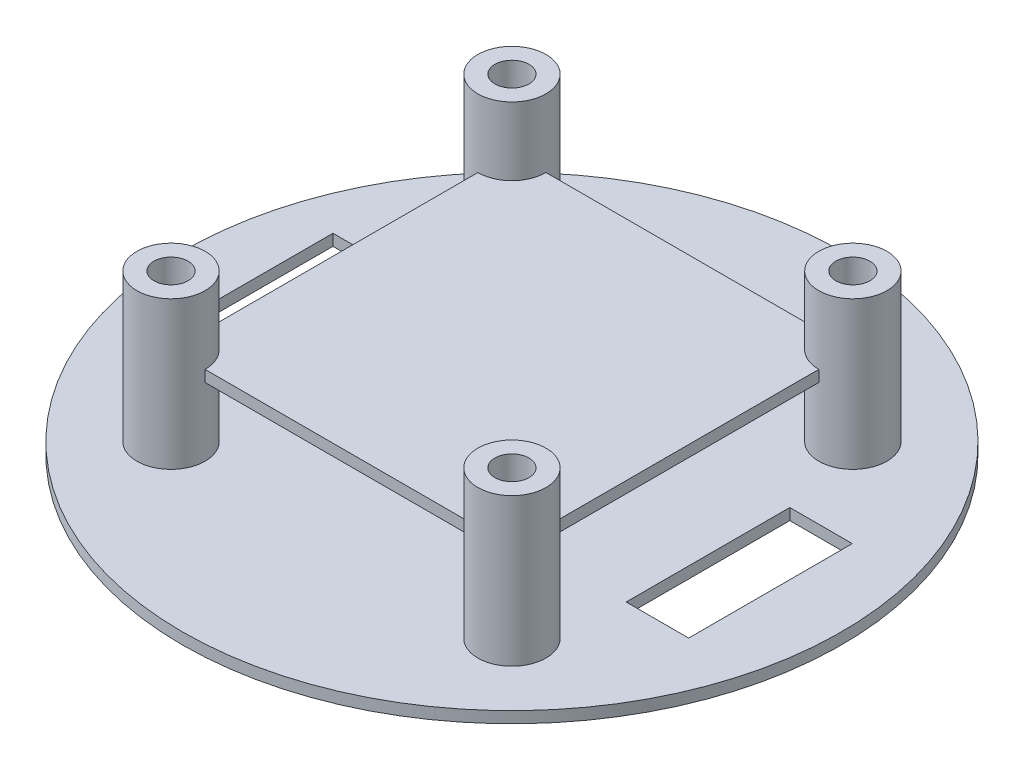
ISO-10303-21;
HEADER;
FILE_DESCRIPTION(('STEP AP214'),'2;1');
FILE_NAME('part.step','',(''),(''),'','','');
FILE_SCHEMA(('AUTOMOTIVE_DESIGN { 1 0 10303 214 1 1 1 1 }'));
ENDSEC;
DATA;
#1=APPLICATION_CONTEXT('core data for automotive mechanical design processes');
#2=APPLICATION_PROTOCOL_DEFINITION('international standard','automotive_design',2000,#1);
#3=PRODUCT_CONTEXT('',#1,'mechanical');
#4=PRODUCT('Part','Part','',(#3));
#5=PRODUCT_RELATED_PRODUCT_CATEGORY('part','',(#4));
#6=PRODUCT_DEFINITION_FORMATION('','',#4);
#7=PRODUCT_DEFINITION_CONTEXT('part definition',#1,'design');
#8=PRODUCT_DEFINITION('design','',#6,#7);
#9=PRODUCT_DEFINITION_SHAPE('','',#8);
#10=(LENGTH_UNIT() NAMED_UNIT(*) SI_UNIT(.MILLI.,.METRE.));
#11=(NAMED_UNIT(*) PLANE_ANGLE_UNIT() SI_UNIT($,.RADIAN.));
#12=(NAMED_UNIT(*) SI_UNIT($,.STERADIAN.) SOLID_ANGLE_UNIT());
#13=UNCERTAINTY_MEASURE_WITH_UNIT(LENGTH_MEASURE(1.E-05),#10,'distance_accuracy_value','');
#14=(GEOMETRIC_REPRESENTATION_CONTEXT(3) GLOBAL_UNCERTAINTY_ASSIGNED_CONTEXT((#13)) GLOBAL_UNIT_ASSIGNED_CONTEXT((#10,
#11,#12)) REPRESENTATION_CONTEXT('',''));
#15=CARTESIAN_POINT('',(0.,0.,0.));
#16=DIRECTION('',(0.,0.,1.));
#17=DIRECTION('',(1.,0.,0.));
#18=AXIS2_PLACEMENT_3D('',#15,#16,#17);
#19=CARTESIAN_POINT('',(-15.,8.,-15.));
#20=DIRECTION('',(0.,1.,0.));
#21=DIRECTION('',(0.,0.,1.));
#22=AXIS2_PLACEMENT_3D('',#19,#20,#21);
#23=PLANE('',#22);
#24=DIRECTION('',(0.,0.,1.));
#25=VECTOR('',#24,1.);
#26=CARTESIAN_POINT('',(-15.,8.,12.));
#27=LINE('',#26,#25);
#28=CARTESIAN_POINT('',(-15.,8.,-12.));
#29=VERTEX_POINT('',#28);
#30=CARTESIAN_POINT('',(-15.,8.,12.));
#31=VERTEX_POINT('',#30);
#32=EDGE_CURVE('E266',#29,#31,#27,.T.);
#33=ORIENTED_EDGE('',*,*,#32,.T.);
#34=CARTESIAN_POINT('',(-15.,8.,15.));
#35=DIRECTION('',(0.,1.,0.));
#36=DIRECTION('',(0.,0.,1.));
#37=AXIS2_PLACEMENT_3D('',#34,#35,#36);
#38=CIRCLE('',#37,3.);
#39=CARTESIAN_POINT('',(-12.,8.,15.));
#40=VERTEX_POINT('',#39);
#41=EDGE_CURVE('E238',#40,#31,#38,.T.);
#42=ORIENTED_EDGE('',*,*,#41,.F.);
#43=DIRECTION('',(1.,0.,0.));
#44=VECTOR('',#43,1.);
#45=CARTESIAN_POINT('',(-12.,8.,15.));
#46=LINE('',#45,#44);
#47=CARTESIAN_POINT('',(12.,8.,15.));
#48=VERTEX_POINT('',#47);
#49=EDGE_CURVE('E260',#40,#48,#46,.T.);
#50=ORIENTED_EDGE('',*,*,#49,.T.);
#51=CARTESIAN_POINT('',(15.,8.,15.));
#52=DIRECTION('',(0.,1.,0.));
#53=DIRECTION('',(0.,0.,1.));
#54=AXIS2_PLACEMENT_3D('',#51,#52,#53);
#55=CIRCLE('',#54,3.);
#56=CARTESIAN_POINT('',(15.,8.,12.));
#57=VERTEX_POINT('',#56);
#58=EDGE_CURVE('E250',#57,#48,#55,.T.);
#59=ORIENTED_EDGE('',*,*,#58,.F.);
#60=DIRECTION('',(0.,0.,-1.));
#61=VECTOR('',#60,1.);
#62=CARTESIAN_POINT('',(15.,8.,12.));
#63=LINE('',#62,#61);
#64=CARTESIAN_POINT('',(15.,8.,-12.));
#65=VERTEX_POINT('',#64);
#66=EDGE_CURVE('E289',#57,#65,#63,.T.);
#67=ORIENTED_EDGE('',*,*,#66,.T.);
#68=CARTESIAN_POINT('',(15.,8.,-15.));
#69=DIRECTION('',(0.,1.,0.));
#70=DIRECTION('',(0.,0.,1.));
#71=AXIS2_PLACEMENT_3D('',#68,#69,#70);
#72=CIRCLE('',#71,3.);
#73=CARTESIAN_POINT('',(12.,8.,-15.));
#74=VERTEX_POINT('',#73);
#75=EDGE_CURVE('E11',#74,#65,#72,.T.);
#76=ORIENTED_EDGE('',*,*,#75,.F.);
#77=DIRECTION('',(-1.,0.,0.));
#78=VECTOR('',#77,1.);
#79=CARTESIAN_POINT('',(-12.,8.,-15.));
#80=LINE('',#79,#78);
#81=CARTESIAN_POINT('',(-12.,8.,-15.));
#82=VERTEX_POINT('',#81);
#83=EDGE_CURVE('E292',#74,#82,#80,.T.);
#84=ORIENTED_EDGE('',*,*,#83,.T.);
#85=CARTESIAN_POINT('',(-15.,8.,-15.));
#86=DIRECTION('',(0.,1.,0.));
#87=DIRECTION('',(0.,0.,1.));
#88=AXIS2_PLACEMENT_3D('',#85,#86,#87);
#89=CIRCLE('',#88,3.);
#90=EDGE_CURVE('E244',#29,#82,#89,.T.);
#91=ORIENTED_EDGE('',*,*,#90,.F.);
#92=EDGE_LOOP('',(#33,#42,#50,#59,#67,#76,#84,#91));
#93=FACE_BOUND('',#92,.T.);
#94=ADVANCED_FACE('F35',(#93),#23,.T.);
#95=CARTESIAN_POINT('',(0.,1.,0.));
#96=DIRECTION('',(0.,-1.,0.));
#97=DIRECTION('',(0.,0.,-1.));
#98=AXIS2_PLACEMENT_3D('',#95,#96,#97);
#99=CYLINDRICAL_SURFACE('',#98,29.);
#100=CARTESIAN_POINT('',(0.,1.,0.));
#101=DIRECTION('',(0.,1.,0.));
#102=DIRECTION('',(0.,0.,1.));
#103=AXIS2_PLACEMENT_3D('',#100,#101,#102);
#104=CIRCLE('',#103,29.);
#105=CARTESIAN_POINT('',(0.,1.,29.));
#106=VERTEX_POINT('',#105);
#107=EDGE_CURVE('E44',#106,#106,#104,.T.);
#108=ORIENTED_EDGE('',*,*,#107,.F.);
#109=EDGE_LOOP('',(#108));
#110=FACE_BOUND('',#109,.T.);
#111=CARTESIAN_POINT('',(0.,0.,0.));
#112=DIRECTION('',(0.,1.,0.));
#113=DIRECTION('',(0.,0.,1.));
#114=AXIS2_PLACEMENT_3D('',#111,#112,#113);
#115=CIRCLE('',#114,29.);
#116=CARTESIAN_POINT('',(0.,0.,29.));
#117=VERTEX_POINT('',#116);
#118=EDGE_CURVE('E39',#117,#117,#115,.T.);
#119=ORIENTED_EDGE('',*,*,#118,.T.);
#120=EDGE_LOOP('',(#119));
#121=FACE_BOUND('',#120,.T.);
#122=ADVANCED_FACE('F37',(#110,#121),#99,.T.);
#123=CARTESIAN_POINT('',(0.,1.,0.));
#124=DIRECTION('',(0.,1.,0.));
#125=DIRECTION('',(0.,0.,1.));
#126=AXIS2_PLACEMENT_3D('',#123,#124,#125);
#127=PLANE('',#126);
#128=DIRECTION('',(0.,0.,1.));
#129=VECTOR('',#128,1.);
#130=CARTESIAN_POINT('',(-16.25,1.,8.));
#131=LINE('',#130,#129);
#132=CARTESIAN_POINT('',(-16.25,1.,-8.));
#133=VERTEX_POINT('',#132);
#134=CARTESIAN_POINT('',(-16.25,1.,8.));
#135=VERTEX_POINT('',#134);
#136=EDGE_CURVE('E160',#133,#135,#131,.T.);
#137=ORIENTED_EDGE('',*,*,#136,.T.);
#138=DIRECTION('',(-1.,0.,0.));
#139=VECTOR('',#138,1.);
#140=CARTESIAN_POINT('',(-23.75,1.,8.));
#141=LINE('',#140,#139);
#142=CARTESIAN_POINT('',(-23.75,1.,8.));
#143=VERTEX_POINT('',#142);
#144=EDGE_CURVE('E149',#135,#143,#141,.T.);
#145=ORIENTED_EDGE('',*,*,#144,.T.);
#146=DIRECTION('',(0.,0.,-1.));
#147=VECTOR('',#146,1.);
#148=CARTESIAN_POINT('',(-23.75,1.,8.));
#149=LINE('',#148,#147);
#150=CARTESIAN_POINT('',(-23.75,1.,-8.));
#151=VERTEX_POINT('',#150);
#152=EDGE_CURVE('E171',#143,#151,#149,.T.);
#153=ORIENTED_EDGE('',*,*,#152,.T.);
#154=DIRECTION('',(1.,0.,0.));
#155=VECTOR('',#154,1.);
#156=CARTESIAN_POINT('',(-23.75,1.,-8.));
#157=LINE('',#156,#155);
#158=EDGE_CURVE('E167',#151,#133,#157,.T.);
#159=ORIENTED_EDGE('',*,*,#158,.T.);
#160=EDGE_LOOP('',(#137,#145,#153,#159));
#161=FACE_BOUND('',#160,.T.);
#162=DIRECTION('',(0.,0.,1.));
#163=VECTOR('',#162,1.);
#164=CARTESIAN_POINT('',(22.75,1.,-7.2));
#165=LINE('',#164,#163);
#166=CARTESIAN_POINT('',(22.75,1.,-7.2));
#167=VERTEX_POINT('',#166);
#168=CARTESIAN_POINT('',(22.75,1.,7.2));
#169=VERTEX_POINT('',#168);
#170=EDGE_CURVE('E190',#167,#169,#165,.T.);
#171=ORIENTED_EDGE('',*,*,#170,.T.);
#172=DIRECTION('',(-1.,0.,0.));
#173=VECTOR('',#172,1.);
#174=CARTESIAN_POINT('',(17.25,1.,7.2));
#175=LINE('',#174,#173);
#176=CARTESIAN_POINT('',(17.25,1.,7.2));
#177=VERTEX_POINT('',#176);
#178=EDGE_CURVE('E207',#169,#177,#175,.T.);
#179=ORIENTED_EDGE('',*,*,#178,.T.);
#180=DIRECTION('',(0.,0.,-1.));
#181=VECTOR('',#180,1.);
#182=CARTESIAN_POINT('',(17.25,1.,-7.2));
#183=LINE('',#182,#181);
#184=CARTESIAN_POINT('',(17.25,1.,-7.2));
#185=VERTEX_POINT('',#184);
#186=EDGE_CURVE('E156',#177,#185,#183,.T.);
#187=ORIENTED_EDGE('',*,*,#186,.T.);
#188=DIRECTION('',(1.,0.,0.));
#189=VECTOR('',#188,1.);
#190=CARTESIAN_POINT('',(17.25,1.,-7.2));
#191=LINE('',#190,#189);
#192=EDGE_CURVE('E187',#185,#167,#191,.T.);
#193=ORIENTED_EDGE('',*,*,#192,.T.);
#194=EDGE_LOOP('',(#171,#179,#187,#193));
#195=FACE_BOUND('',#194,.T.);
#196=CARTESIAN_POINT('',(15.,1.,15.));
#197=DIRECTION('',(0.,1.,0.));
#198=DIRECTION('',(0.,0.,1.));
#199=AXIS2_PLACEMENT_3D('',#196,#197,#198);
#200=CIRCLE('',#199,3.);
#201=CARTESIAN_POINT('',(15.,1.,18.));
#202=VERTEX_POINT('',#201);
#203=EDGE_CURVE('E298',#202,#202,#200,.T.);
#204=ORIENTED_EDGE('',*,*,#203,.F.);
#205=EDGE_LOOP('',(#204));
#206=FACE_BOUND('',#205,.T.);
#207=CARTESIAN_POINT('',(-15.,1.,15.));
#208=DIRECTION('',(0.,1.,0.));
#209=DIRECTION('',(0.,0.,1.));
#210=AXIS2_PLACEMENT_3D('',#207,#208,#209);
#211=CIRCLE('',#210,3.);
#212=CARTESIAN_POINT('',(-15.,1.,18.));
#213=VERTEX_POINT('',#212);
#214=EDGE_CURVE('E317',#213,#213,#211,.T.);
#215=ORIENTED_EDGE('',*,*,#214,.F.);
#216=EDGE_LOOP('',(#215));
#217=FACE_BOUND('',#216,.T.);
#218=CARTESIAN_POINT('',(15.,1.,-15.));
#219=DIRECTION('',(0.,1.,0.));
#220=DIRECTION('',(0.,0.,1.));
#221=AXIS2_PLACEMENT_3D('',#218,#219,#220);
#222=CIRCLE('',#221,3.);
#223=CARTESIAN_POINT('',(15.,1.,-12.));
#224=VERTEX_POINT('',#223);
#225=EDGE_CURVE('E320',#224,#224,#222,.T.);
#226=ORIENTED_EDGE('',*,*,#225,.F.);
#227=EDGE_LOOP('',(#226));
#228=FACE_BOUND('',#227,.T.);
#229=CARTESIAN_POINT('',(-15.,1.,-15.));
#230=DIRECTION('',(0.,1.,0.));
#231=DIRECTION('',(0.,0.,1.));
#232=AXIS2_PLACEMENT_3D('',#229,#230,#231);
#233=CIRCLE('',#232,3.);
#234=CARTESIAN_POINT('',(-15.,1.,-12.));
#235=VERTEX_POINT('',#234);
#236=EDGE_CURVE('E323',#235,#235,#233,.T.);
#237=ORIENTED_EDGE('',*,*,#236,.F.);
#238=EDGE_LOOP('',(#237));
#239=FACE_BOUND('',#238,.T.);
#240=ORIENTED_EDGE('',*,*,#107,.T.);
#241=EDGE_LOOP('',(#240));
#242=FACE_BOUND('',#241,.T.);
#243=ADVANCED_FACE('F165',(#161,#195,#206,#217,#228,#239,#242),#127,.T.);
#244=CARTESIAN_POINT('',(0.,0.,0.));
#245=DIRECTION('',(0.,1.,0.));
#246=DIRECTION('',(0.,0.,1.));
#247=AXIS2_PLACEMENT_3D('',#244,#245,#246);
#248=PLANE('',#247);
#249=DIRECTION('',(-1.,0.,0.));
#250=VECTOR('',#249,1.);
#251=CARTESIAN_POINT('',(-23.75,0.,8.));
#252=LINE('',#251,#250);
#253=CARTESIAN_POINT('',(-16.25,0.,8.));
#254=VERTEX_POINT('',#253);
#255=CARTESIAN_POINT('',(-23.75,0.,8.));
#256=VERTEX_POINT('',#255);
#257=EDGE_CURVE('E169',#254,#256,#252,.T.);
#258=ORIENTED_EDGE('',*,*,#257,.F.);
#259=DIRECTION('',(0.,0.,1.));
#260=VECTOR('',#259,1.);
#261=CARTESIAN_POINT('',(-16.25,0.,8.));
#262=LINE('',#261,#260);
#263=CARTESIAN_POINT('',(-16.25,0.,-8.));
#264=VERTEX_POINT('',#263);
#265=EDGE_CURVE('E60',#264,#254,#262,.T.);
#266=ORIENTED_EDGE('',*,*,#265,.F.);
#267=DIRECTION('',(1.,0.,0.));
#268=VECTOR('',#267,1.);
#269=CARTESIAN_POINT('',(-23.75,0.,-8.));
#270=LINE('',#269,#268);
#271=CARTESIAN_POINT('',(-23.75,0.,-8.));
#272=VERTEX_POINT('',#271);
#273=EDGE_CURVE('E162',#272,#264,#270,.T.);
#274=ORIENTED_EDGE('',*,*,#273,.F.);
#275=DIRECTION('',(0.,0.,-1.));
#276=VECTOR('',#275,1.);
#277=CARTESIAN_POINT('',(-23.75,0.,8.));
#278=LINE('',#277,#276);
#279=EDGE_CURVE('E176',#256,#272,#278,.T.);
#280=ORIENTED_EDGE('',*,*,#279,.F.);
#281=EDGE_LOOP('',(#258,#266,#274,#280));
#282=FACE_BOUND('',#281,.T.);
#283=DIRECTION('',(-1.,0.,0.));
#284=VECTOR('',#283,1.);
#285=CARTESIAN_POINT('',(17.25,0.,7.2));
#286=LINE('',#285,#284);
#287=CARTESIAN_POINT('',(22.75,0.,7.2));
#288=VERTEX_POINT('',#287);
#289=CARTESIAN_POINT('',(17.25,0.,7.2));
#290=VERTEX_POINT('',#289);
#291=EDGE_CURVE('E195',#288,#290,#286,.T.);
#292=ORIENTED_EDGE('',*,*,#291,.F.);
#293=DIRECTION('',(0.,0.,1.));
#294=VECTOR('',#293,1.);
#295=CARTESIAN_POINT('',(22.75,0.,-7.2));
#296=LINE('',#295,#294);
#297=CARTESIAN_POINT('',(22.75,0.,-7.2));
#298=VERTEX_POINT('',#297);
#299=EDGE_CURVE('E193',#298,#288,#296,.T.);
#300=ORIENTED_EDGE('',*,*,#299,.F.);
#301=DIRECTION('',(1.,0.,0.));
#302=VECTOR('',#301,1.);
#303=CARTESIAN_POINT('',(17.25,0.,-7.2));
#304=LINE('',#303,#302);
#305=CARTESIAN_POINT('',(17.25,0.,-7.2));
#306=VERTEX_POINT('',#305);
#307=EDGE_CURVE('E201',#306,#298,#304,.T.);
#308=ORIENTED_EDGE('',*,*,#307,.F.);
#309=DIRECTION('',(0.,0.,-1.));
#310=VECTOR('',#309,1.);
#311=CARTESIAN_POINT('',(17.25,0.,-7.2));
#312=LINE('',#311,#310);
#313=EDGE_CURVE('E198',#290,#306,#312,.T.);
#314=ORIENTED_EDGE('',*,*,#313,.F.);
#315=EDGE_LOOP('',(#292,#300,#308,#314));
#316=FACE_BOUND('',#315,.T.);
#317=ORIENTED_EDGE('',*,*,#118,.F.);
#318=EDGE_LOOP('',(#317));
#319=FACE_BOUND('',#318,.T.);
#320=ADVANCED_FACE('F332',(#282,#316,#319),#248,.F.);
#321=CARTESIAN_POINT('',(-15.,8.,-15.));
#322=DIRECTION('',(0.,-1.,0.));
#323=DIRECTION('',(0.,0.,-1.));
#324=AXIS2_PLACEMENT_3D('',#321,#322,#323);
#325=CYLINDRICAL_SURFACE('',#324,3.);
#326=CARTESIAN_POINT('',(-15.,7.,-15.));
#327=DIRECTION('',(0.,-1.,0.));
#328=DIRECTION('',(0.,0.,-1.));
#329=AXIS2_PLACEMENT_3D('',#326,#327,#328);
#330=CIRCLE('',#329,3.);
#331=CARTESIAN_POINT('',(-12.,7.,-15.));
#332=VERTEX_POINT('',#331);
#333=CARTESIAN_POINT('',(-15.,7.,-12.));
#334=VERTEX_POINT('',#333);
#335=EDGE_CURVE('E281',#332,#334,#330,.T.);
#336=ORIENTED_EDGE('',*,*,#335,.T.);
#337=DIRECTION('',(0.,1.,0.));
#338=VECTOR('',#337,1.);
#339=CARTESIAN_POINT('',(-15.,7.,-12.));
#340=LINE('',#339,#338);
#341=EDGE_CURVE('E299',#334,#29,#340,.T.);
#342=ORIENTED_EDGE('',*,*,#341,.T.);
#343=ORIENTED_EDGE('',*,*,#90,.T.);
#344=DIRECTION('',(0.,1.,0.));
#345=VECTOR('',#344,1.);
#346=CARTESIAN_POINT('',(-12.,7.,-15.));
#347=LINE('',#346,#345);
#348=EDGE_CURVE('E301',#332,#82,#347,.T.);
#349=ORIENTED_EDGE('',*,*,#348,.F.);
#350=EDGE_LOOP('',(#336,#342,#343,#349));
#351=FACE_BOUND('',#350,.T.);
#352=ORIENTED_EDGE('',*,*,#236,.T.);
#353=EDGE_LOOP('',(#352));
#354=FACE_BOUND('',#353,.T.);
#355=CARTESIAN_POINT('',(-15.,14.,-15.));
#356=DIRECTION('',(0.,1.,0.));
#357=DIRECTION('',(0.,0.,1.));
#358=AXIS2_PLACEMENT_3D('',#355,#356,#357);
#359=CIRCLE('',#358,3.);
#360=CARTESIAN_POINT('',(-15.,14.,-12.));
#361=VERTEX_POINT('',#360);
#362=EDGE_CURVE('E247',#361,#361,#359,.T.);
#363=ORIENTED_EDGE('',*,*,#362,.F.);
#364=EDGE_LOOP('',(#363));
#365=FACE_BOUND('',#364,.T.);
#366=ADVANCED_FACE('F334',(#351,#354,#365),#325,.T.);
#367=CARTESIAN_POINT('',(15.,8.,-15.));
#368=DIRECTION('',(0.,-1.,0.));
#369=DIRECTION('',(0.,0.,-1.));
#370=AXIS2_PLACEMENT_3D('',#367,#368,#369);
#371=CYLINDRICAL_SURFACE('',#370,3.);
#372=CARTESIAN_POINT('',(15.,7.,-15.));
#373=DIRECTION('',(0.,-1.,0.));
#374=DIRECTION('',(0.,0.,-1.));
#375=AXIS2_PLACEMENT_3D('',#372,#373,#374);
#376=CIRCLE('',#375,3.);
#377=CARTESIAN_POINT('',(15.,7.,-12.));
#378=VERTEX_POINT('',#377);
#379=CARTESIAN_POINT('',(12.,7.,-15.));
#380=VERTEX_POINT('',#379);
#381=EDGE_CURVE('E275',#378,#380,#376,.T.);
#382=ORIENTED_EDGE('',*,*,#381,.T.);
#383=DIRECTION('',(0.,1.,0.));
#384=VECTOR('',#383,1.);
#385=CARTESIAN_POINT('',(12.,7.,-15.));
#386=LINE('',#385,#384);
#387=EDGE_CURVE('E304',#380,#74,#386,.T.);
#388=ORIENTED_EDGE('',*,*,#387,.T.);
#389=ORIENTED_EDGE('',*,*,#75,.T.);
#390=DIRECTION('',(0.,1.,0.));
#391=VECTOR('',#390,1.);
#392=CARTESIAN_POINT('',(15.,7.,-12.));
#393=LINE('',#392,#391);
#394=EDGE_CURVE('E307',#378,#65,#393,.T.);
#395=ORIENTED_EDGE('',*,*,#394,.F.);
#396=EDGE_LOOP('',(#382,#388,#389,#395));
#397=FACE_BOUND('',#396,.T.);
#398=ORIENTED_EDGE('',*,*,#225,.T.);
#399=EDGE_LOOP('',(#398));
#400=FACE_BOUND('',#399,.T.);
#401=CARTESIAN_POINT('',(15.,14.,-15.));
#402=DIRECTION('',(0.,1.,0.));
#403=DIRECTION('',(0.,0.,1.));
#404=AXIS2_PLACEMENT_3D('',#401,#402,#403);
#405=CIRCLE('',#404,3.);
#406=CARTESIAN_POINT('',(15.,14.,-12.));
#407=VERTEX_POINT('',#406);
#408=EDGE_CURVE('E256',#407,#407,#405,.T.);
#409=ORIENTED_EDGE('',*,*,#408,.F.);
#410=EDGE_LOOP('',(#409));
#411=FACE_BOUND('',#410,.T.);
#412=ADVANCED_FACE('F340',(#397,#400,#411),#371,.T.);
#413=CARTESIAN_POINT('',(-15.,8.,15.));
#414=DIRECTION('',(0.,-1.,0.));
#415=DIRECTION('',(0.,0.,-1.));
#416=AXIS2_PLACEMENT_3D('',#413,#414,#415);
#417=CYLINDRICAL_SURFACE('',#416,3.);
#418=DIRECTION('',(0.,1.,0.));
#419=VECTOR('',#418,1.);
#420=CARTESIAN_POINT('',(-12.,7.,15.));
#421=LINE('',#420,#419);
#422=CARTESIAN_POINT('',(-12.,7.,15.));
#423=VERTEX_POINT('',#422);
#424=EDGE_CURVE('E287',#423,#40,#421,.T.);
#425=ORIENTED_EDGE('',*,*,#424,.T.);
#426=ORIENTED_EDGE('',*,*,#41,.T.);
#427=DIRECTION('',(0.,1.,0.));
#428=VECTOR('',#427,1.);
#429=CARTESIAN_POINT('',(-15.,7.,12.));
#430=LINE('',#429,#428);
#431=CARTESIAN_POINT('',(-15.,7.,12.));
#432=VERTEX_POINT('',#431);
#433=EDGE_CURVE('E295',#432,#31,#430,.T.);
#434=ORIENTED_EDGE('',*,*,#433,.F.);
#435=CARTESIAN_POINT('',(-15.,7.,15.));
#436=DIRECTION('',(0.,-1.,0.));
#437=DIRECTION('',(0.,0.,1.));
#438=AXIS2_PLACEMENT_3D('',#435,#436,#437);
#439=CIRCLE('',#438,3.);
#440=EDGE_CURVE('E262',#432,#423,#439,.T.);
#441=ORIENTED_EDGE('',*,*,#440,.T.);
#442=EDGE_LOOP('',(#425,#426,#434,#441));
#443=FACE_BOUND('',#442,.T.);
#444=ORIENTED_EDGE('',*,*,#214,.T.);
#445=EDGE_LOOP('',(#444));
#446=FACE_BOUND('',#445,.T.);
#447=CARTESIAN_POINT('',(-15.,14.,15.));
#448=DIRECTION('',(0.,1.,0.));
#449=DIRECTION('',(0.,0.,1.));
#450=AXIS2_PLACEMENT_3D('',#447,#448,#449);
#451=CIRCLE('',#450,3.);
#452=CARTESIAN_POINT('',(-15.,14.,18.));
#453=VERTEX_POINT('',#452);
#454=EDGE_CURVE('E241',#453,#453,#451,.T.);
#455=ORIENTED_EDGE('',*,*,#454,.F.);
#456=EDGE_LOOP('',(#455));
#457=FACE_BOUND('',#456,.T.);
#458=ADVANCED_FACE('F355',(#443,#446,#457),#417,.T.);
#459=CARTESIAN_POINT('',(15.,8.,15.));
#460=DIRECTION('',(0.,-1.,0.));
#461=DIRECTION('',(0.,0.,-1.));
#462=AXIS2_PLACEMENT_3D('',#459,#460,#461);
#463=CYLINDRICAL_SURFACE('',#462,3.);
#464=CARTESIAN_POINT('',(15.,7.,15.));
#465=DIRECTION('',(0.,-1.,0.));
#466=DIRECTION('',(0.,0.,-1.));
#467=AXIS2_PLACEMENT_3D('',#464,#465,#466);
#468=CIRCLE('',#467,3.);
#469=CARTESIAN_POINT('',(12.,7.,15.));
#470=VERTEX_POINT('',#469);
#471=CARTESIAN_POINT('',(15.,7.,12.));
#472=VERTEX_POINT('',#471);
#473=EDGE_CURVE('E269',#470,#472,#468,.T.);
#474=ORIENTED_EDGE('',*,*,#473,.T.);
#475=DIRECTION('',(0.,1.,0.));
#476=VECTOR('',#475,1.);
#477=CARTESIAN_POINT('',(15.,7.,12.));
#478=LINE('',#477,#476);
#479=EDGE_CURVE('E309',#472,#57,#478,.T.);
#480=ORIENTED_EDGE('',*,*,#479,.T.);
#481=ORIENTED_EDGE('',*,*,#58,.T.);
#482=DIRECTION('',(0.,1.,0.));
#483=VECTOR('',#482,1.);
#484=CARTESIAN_POINT('',(12.,7.,15.));
#485=LINE('',#484,#483);
#486=EDGE_CURVE('E311',#470,#48,#485,.T.);
#487=ORIENTED_EDGE('',*,*,#486,.F.);
#488=EDGE_LOOP('',(#474,#480,#481,#487));
#489=FACE_BOUND('',#488,.T.);
#490=ORIENTED_EDGE('',*,*,#203,.T.);
#491=EDGE_LOOP('',(#490));
#492=FACE_BOUND('',#491,.T.);
#493=CARTESIAN_POINT('',(15.,14.,15.));
#494=DIRECTION('',(0.,1.,0.));
#495=DIRECTION('',(0.,0.,1.));
#496=AXIS2_PLACEMENT_3D('',#493,#494,#495);
#497=CIRCLE('',#496,3.);
#498=CARTESIAN_POINT('',(15.,14.,18.));
#499=VERTEX_POINT('',#498);
#500=EDGE_CURVE('E253',#499,#499,#497,.T.);
#501=ORIENTED_EDGE('',*,*,#500,.F.);
#502=EDGE_LOOP('',(#501));
#503=FACE_BOUND('',#502,.T.);
#504=ADVANCED_FACE('F359',(#489,#492,#503),#463,.T.);
#505=CARTESIAN_POINT('',(-15.,7.,12.));
#506=DIRECTION('',(-1.,0.,0.));
#507=DIRECTION('',(0.,0.,1.));
#508=AXIS2_PLACEMENT_3D('',#505,#506,#507);
#509=PLANE('',#508);
#510=ORIENTED_EDGE('',*,*,#32,.F.);
#511=ORIENTED_EDGE('',*,*,#341,.F.);
#512=DIRECTION('',(0.,0.,1.));
#513=VECTOR('',#512,1.);
#514=CARTESIAN_POINT('',(-15.,7.,12.));
#515=LINE('',#514,#513);
#516=EDGE_CURVE('E284',#334,#432,#515,.T.);
#517=ORIENTED_EDGE('',*,*,#516,.T.);
#518=ORIENTED_EDGE('',*,*,#433,.T.);
#519=EDGE_LOOP('',(#510,#511,#517,#518));
#520=FACE_BOUND('',#519,.T.);
#521=ADVANCED_FACE('F363',(#520),#509,.T.);
#522=CARTESIAN_POINT('',(-12.,7.,-15.));
#523=DIRECTION('',(0.,0.,-1.));
#524=DIRECTION('',(-1.,0.,0.));
#525=AXIS2_PLACEMENT_3D('',#522,#523,#524);
#526=PLANE('',#525);
#527=ORIENTED_EDGE('',*,*,#83,.F.);
#528=ORIENTED_EDGE('',*,*,#387,.F.);
#529=DIRECTION('',(-1.,0.,0.));
#530=VECTOR('',#529,1.);
#531=CARTESIAN_POINT('',(-12.,7.,-15.));
#532=LINE('',#531,#530);
#533=EDGE_CURVE('E278',#380,#332,#532,.T.);
#534=ORIENTED_EDGE('',*,*,#533,.T.);
#535=ORIENTED_EDGE('',*,*,#348,.T.);
#536=EDGE_LOOP('',(#527,#528,#534,#535));
#537=FACE_BOUND('',#536,.T.);
#538=ADVANCED_FACE('F373',(#537),#526,.T.);
#539=CARTESIAN_POINT('',(15.,7.,12.));
#540=DIRECTION('',(1.,0.,0.));
#541=DIRECTION('',(0.,0.,-1.));
#542=AXIS2_PLACEMENT_3D('',#539,#540,#541);
#543=PLANE('',#542);
#544=ORIENTED_EDGE('',*,*,#66,.F.);
#545=ORIENTED_EDGE('',*,*,#479,.F.);
#546=DIRECTION('',(0.,0.,-1.));
#547=VECTOR('',#546,1.);
#548=CARTESIAN_POINT('',(15.,7.,12.));
#549=LINE('',#548,#547);
#550=EDGE_CURVE('E272',#472,#378,#549,.T.);
#551=ORIENTED_EDGE('',*,*,#550,.T.);
#552=ORIENTED_EDGE('',*,*,#394,.T.);
#553=EDGE_LOOP('',(#544,#545,#551,#552));
#554=FACE_BOUND('',#553,.T.);
#555=ADVANCED_FACE('F369',(#554),#543,.T.);
#556=CARTESIAN_POINT('',(-12.,7.,15.));
#557=DIRECTION('',(0.,0.,1.));
#558=DIRECTION('',(1.,0.,0.));
#559=AXIS2_PLACEMENT_3D('',#556,#557,#558);
#560=PLANE('',#559);
#561=ORIENTED_EDGE('',*,*,#49,.F.);
#562=ORIENTED_EDGE('',*,*,#424,.F.);
#563=DIRECTION('',(1.,0.,0.));
#564=VECTOR('',#563,1.);
#565=CARTESIAN_POINT('',(-12.,7.,15.));
#566=LINE('',#565,#564);
#567=EDGE_CURVE('E265',#423,#470,#566,.T.);
#568=ORIENTED_EDGE('',*,*,#567,.T.);
#569=ORIENTED_EDGE('',*,*,#486,.T.);
#570=EDGE_LOOP('',(#561,#562,#568,#569));
#571=FACE_BOUND('',#570,.T.);
#572=ADVANCED_FACE('F365',(#571),#560,.T.);
#573=CARTESIAN_POINT('',(-15.,7.,15.));
#574=DIRECTION('',(0.,1.,0.));
#575=DIRECTION('',(0.,0.,1.));
#576=AXIS2_PLACEMENT_3D('',#573,#574,#575);
#577=PLANE('',#576);
#578=ORIENTED_EDGE('',*,*,#440,.F.);
#579=ORIENTED_EDGE('',*,*,#516,.F.);
#580=ORIENTED_EDGE('',*,*,#335,.F.);
#581=ORIENTED_EDGE('',*,*,#533,.F.);
#582=ORIENTED_EDGE('',*,*,#381,.F.);
#583=ORIENTED_EDGE('',*,*,#550,.F.);
#584=ORIENTED_EDGE('',*,*,#473,.F.);
#585=ORIENTED_EDGE('',*,*,#567,.F.);
#586=EDGE_LOOP('',(#578,#579,#580,#581,#582,#583,#584,#585));
#587=FACE_BOUND('',#586,.T.);
#588=ADVANCED_FACE('F368',(#587),#577,.F.);
#589=CARTESIAN_POINT('',(15.,14.,-15.));
#590=DIRECTION('',(0.,1.,0.));
#591=DIRECTION('',(0.,0.,1.));
#592=AXIS2_PLACEMENT_3D('',#589,#590,#591);
#593=PLANE('',#592);
#594=CARTESIAN_POINT('',(15.,14.,-15.));
#595=DIRECTION('',(0.,1.,0.));
#596=DIRECTION('',(0.,0.,1.));
#597=AXIS2_PLACEMENT_3D('',#594,#595,#596);
#598=CIRCLE('',#597,1.5);
#599=CARTESIAN_POINT('',(15.,14.,-13.5));
#600=VERTEX_POINT('',#599);
#601=EDGE_CURVE('E220',#600,#600,#598,.T.);
#602=ORIENTED_EDGE('',*,*,#601,.F.);
#603=EDGE_LOOP('',(#602));
#604=FACE_BOUND('',#603,.T.);
#605=ORIENTED_EDGE('',*,*,#408,.T.);
#606=EDGE_LOOP('',(#605));
#607=FACE_BOUND('',#606,.T.);
#608=ADVANCED_FACE('F383',(#604,#607),#593,.T.);
#609=CARTESIAN_POINT('',(15.,14.,15.));
#610=DIRECTION('',(0.,1.,0.));
#611=DIRECTION('',(0.,0.,1.));
#612=AXIS2_PLACEMENT_3D('',#609,#610,#611);
#613=PLANE('',#612);
#614=CARTESIAN_POINT('',(15.,14.,15.));
#615=DIRECTION('',(0.,1.,0.));
#616=DIRECTION('',(0.,0.,1.));
#617=AXIS2_PLACEMENT_3D('',#614,#615,#616);
#618=CIRCLE('',#617,1.5);
#619=CARTESIAN_POINT('',(15.,14.,16.5));
#620=VERTEX_POINT('',#619);
#621=EDGE_CURVE('E221',#620,#620,#618,.T.);
#622=ORIENTED_EDGE('',*,*,#621,.F.);
#623=EDGE_LOOP('',(#622));
#624=FACE_BOUND('',#623,.T.);
#625=ORIENTED_EDGE('',*,*,#500,.T.);
#626=EDGE_LOOP('',(#625));
#627=FACE_BOUND('',#626,.T.);
#628=ADVANCED_FACE('F387',(#624,#627),#613,.T.);
#629=CARTESIAN_POINT('',(-15.,14.,-15.));
#630=DIRECTION('',(0.,1.,0.));
#631=DIRECTION('',(0.,0.,1.));
#632=AXIS2_PLACEMENT_3D('',#629,#630,#631);
#633=PLANE('',#632);
#634=CARTESIAN_POINT('',(-15.,14.,-15.));
#635=DIRECTION('',(0.,1.,0.));
#636=DIRECTION('',(0.,0.,1.));
#637=AXIS2_PLACEMENT_3D('',#634,#635,#636);
#638=CIRCLE('',#637,1.5);
#639=CARTESIAN_POINT('',(-15.,14.,-13.5));
#640=VERTEX_POINT('',#639);
#641=EDGE_CURVE('E216',#640,#640,#638,.T.);
#642=ORIENTED_EDGE('',*,*,#641,.F.);
#643=EDGE_LOOP('',(#642));
#644=FACE_BOUND('',#643,.T.);
#645=ORIENTED_EDGE('',*,*,#362,.T.);
#646=EDGE_LOOP('',(#645));
#647=FACE_BOUND('',#646,.T.);
#648=ADVANCED_FACE('F391',(#644,#647),#633,.T.);
#649=CARTESIAN_POINT('',(-15.,14.,15.));
#650=DIRECTION('',(0.,1.,0.));
#651=DIRECTION('',(0.,0.,1.));
#652=AXIS2_PLACEMENT_3D('',#649,#650,#651);
#653=PLANE('',#652);
#654=CARTESIAN_POINT('',(-15.,14.,15.));
#655=DIRECTION('',(0.,1.,0.));
#656=DIRECTION('',(0.,0.,1.));
#657=AXIS2_PLACEMENT_3D('',#654,#655,#656);
#658=CIRCLE('',#657,1.5);
#659=CARTESIAN_POINT('',(-15.,14.,16.5));
#660=VERTEX_POINT('',#659);
#661=EDGE_CURVE('E227',#660,#660,#658,.T.);
#662=ORIENTED_EDGE('',*,*,#661,.F.);
#663=EDGE_LOOP('',(#662));
#664=FACE_BOUND('',#663,.T.);
#665=ORIENTED_EDGE('',*,*,#454,.T.);
#666=EDGE_LOOP('',(#665));
#667=FACE_BOUND('',#666,.T.);
#668=ADVANCED_FACE('F395',(#664,#667),#653,.T.);
#669=CARTESIAN_POINT('',(15.,8.,-15.));
#670=DIRECTION('',(0.,1.,0.));
#671=DIRECTION('',(0.,0.,1.));
#672=AXIS2_PLACEMENT_3D('',#669,#670,#671);
#673=CYLINDRICAL_SURFACE('',#672,1.5);
#674=CARTESIAN_POINT('',(15.,8.,-15.));
#675=DIRECTION('',(0.,1.,0.));
#676=DIRECTION('',(0.,0.,1.));
#677=AXIS2_PLACEMENT_3D('',#674,#675,#676);
#678=CIRCLE('',#677,1.5);
#679=CARTESIAN_POINT('',(15.,8.,-13.5));
#680=VERTEX_POINT('',#679);
#681=EDGE_CURVE('E235',#680,#680,#678,.T.);
#682=ORIENTED_EDGE('',*,*,#681,.F.);
#683=EDGE_LOOP('',(#682));
#684=FACE_BOUND('',#683,.T.);
#685=ORIENTED_EDGE('',*,*,#601,.T.);
#686=EDGE_LOOP('',(#685));
#687=FACE_BOUND('',#686,.T.);
#688=ADVANCED_FACE('F399',(#684,#687),#673,.F.);
#689=CARTESIAN_POINT('',(15.,8.,-15.));
#690=DIRECTION('',(0.,1.,0.));
#691=DIRECTION('',(0.,0.,1.));
#692=AXIS2_PLACEMENT_3D('',#689,#690,#691);
#693=PLANE('',#692);
#694=ORIENTED_EDGE('',*,*,#681,.T.);
#695=EDGE_LOOP('',(#694));
#696=FACE_BOUND('',#695,.T.);
#697=ADVANCED_FACE('F403',(#696),#693,.T.);
#698=CARTESIAN_POINT('',(-15.,8.,15.));
#699=DIRECTION('',(0.,1.,0.));
#700=DIRECTION('',(0.,0.,1.));
#701=AXIS2_PLACEMENT_3D('',#698,#699,#700);
#702=CYLINDRICAL_SURFACE('',#701,1.5);
#703=CARTESIAN_POINT('',(-15.,8.,15.));
#704=DIRECTION('',(0.,1.,0.));
#705=DIRECTION('',(0.,0.,1.));
#706=AXIS2_PLACEMENT_3D('',#703,#704,#705);
#707=CIRCLE('',#706,1.5);
#708=CARTESIAN_POINT('',(-15.,8.,16.5));
#709=VERTEX_POINT('',#708);
#710=EDGE_CURVE('E224',#709,#709,#707,.T.);
#711=ORIENTED_EDGE('',*,*,#710,.F.);
#712=EDGE_LOOP('',(#711));
#713=FACE_BOUND('',#712,.T.);
#714=ORIENTED_EDGE('',*,*,#661,.T.);
#715=EDGE_LOOP('',(#714));
#716=FACE_BOUND('',#715,.T.);
#717=ADVANCED_FACE('F407',(#713,#716),#702,.F.);
#718=CARTESIAN_POINT('',(-15.,8.,15.));
#719=DIRECTION('',(0.,1.,0.));
#720=DIRECTION('',(0.,0.,1.));
#721=AXIS2_PLACEMENT_3D('',#718,#719,#720);
#722=PLANE('',#721);
#723=ORIENTED_EDGE('',*,*,#710,.T.);
#724=EDGE_LOOP('',(#723));
#725=FACE_BOUND('',#724,.T.);
#726=ADVANCED_FACE('F413',(#725),#722,.T.);
#727=CARTESIAN_POINT('',(-15.,8.,-15.));
#728=DIRECTION('',(0.,1.,0.));
#729=DIRECTION('',(0.,0.,1.));
#730=AXIS2_PLACEMENT_3D('',#727,#728,#729);
#731=CYLINDRICAL_SURFACE('',#730,1.5);
#732=CARTESIAN_POINT('',(-15.,8.,-15.));
#733=DIRECTION('',(0.,1.,0.));
#734=DIRECTION('',(0.,0.,1.));
#735=AXIS2_PLACEMENT_3D('',#732,#733,#734);
#736=CIRCLE('',#735,1.5);
#737=CARTESIAN_POINT('',(-15.,8.,-13.5));
#738=VERTEX_POINT('',#737);
#739=EDGE_CURVE('E230',#738,#738,#736,.T.);
#740=ORIENTED_EDGE('',*,*,#739,.F.);
#741=EDGE_LOOP('',(#740));
#742=FACE_BOUND('',#741,.T.);
#743=ORIENTED_EDGE('',*,*,#641,.T.);
#744=EDGE_LOOP('',(#743));
#745=FACE_BOUND('',#744,.T.);
#746=ADVANCED_FACE('F409',(#742,#745),#731,.F.);
#747=CARTESIAN_POINT('',(-15.,8.,-15.));
#748=DIRECTION('',(0.,1.,0.));
#749=DIRECTION('',(0.,0.,1.));
#750=AXIS2_PLACEMENT_3D('',#747,#748,#749);
#751=PLANE('',#750);
#752=ORIENTED_EDGE('',*,*,#739,.T.);
#753=EDGE_LOOP('',(#752));
#754=FACE_BOUND('',#753,.T.);
#755=ADVANCED_FACE('F412',(#754),#751,.T.);
#756=CARTESIAN_POINT('',(15.,8.,15.));
#757=DIRECTION('',(0.,1.,0.));
#758=DIRECTION('',(0.,0.,1.));
#759=AXIS2_PLACEMENT_3D('',#756,#757,#758);
#760=CYLINDRICAL_SURFACE('',#759,1.5);
#761=CARTESIAN_POINT('',(15.,8.,15.));
#762=DIRECTION('',(0.,1.,0.));
#763=DIRECTION('',(0.,0.,1.));
#764=AXIS2_PLACEMENT_3D('',#761,#762,#763);
#765=CIRCLE('',#764,1.5);
#766=CARTESIAN_POINT('',(15.,8.,16.5));
#767=VERTEX_POINT('',#766);
#768=EDGE_CURVE('E217',#767,#767,#765,.T.);
#769=ORIENTED_EDGE('',*,*,#768,.F.);
#770=EDGE_LOOP('',(#769));
#771=FACE_BOUND('',#770,.T.);
#772=ORIENTED_EDGE('',*,*,#621,.T.);
#773=EDGE_LOOP('',(#772));
#774=FACE_BOUND('',#773,.T.);
#775=ADVANCED_FACE('F417',(#771,#774),#760,.F.);
#776=CARTESIAN_POINT('',(15.,8.,15.));
#777=DIRECTION('',(0.,1.,0.));
#778=DIRECTION('',(0.,0.,1.));
#779=AXIS2_PLACEMENT_3D('',#776,#777,#778);
#780=PLANE('',#779);
#781=ORIENTED_EDGE('',*,*,#768,.T.);
#782=EDGE_LOOP('',(#781));
#783=FACE_BOUND('',#782,.T.);
#784=ADVANCED_FACE('F427',(#783),#780,.T.);
#785=CARTESIAN_POINT('',(22.75,14.001,-7.2));
#786=DIRECTION('',(1.,0.,0.));
#787=DIRECTION('',(0.,0.,-1.));
#788=AXIS2_PLACEMENT_3D('',#785,#786,#787);
#789=PLANE('',#788);
#790=DIRECTION('',(0.,-1.,0.));
#791=VECTOR('',#790,1.);
#792=CARTESIAN_POINT('',(22.75,14.001,-7.2));
#793=LINE('',#792,#791);
#794=EDGE_CURVE('E205',#167,#298,#793,.T.);
#795=ORIENTED_EDGE('',*,*,#794,.T.);
#796=ORIENTED_EDGE('',*,*,#299,.T.);
#797=DIRECTION('',(0.,-1.,0.));
#798=VECTOR('',#797,1.);
#799=CARTESIAN_POINT('',(22.75,14.001,7.2));
#800=LINE('',#799,#798);
#801=EDGE_CURVE('E204',#169,#288,#800,.T.);
#802=ORIENTED_EDGE('',*,*,#801,.F.);
#803=ORIENTED_EDGE('',*,*,#170,.F.);
#804=EDGE_LOOP('',(#795,#796,#802,#803));
#805=FACE_BOUND('',#804,.T.);
#806=ADVANCED_FACE('F431',(#805),#789,.F.);
#807=CARTESIAN_POINT('',(17.25,14.001,-7.2));
#808=DIRECTION('',(0.,0.,-1.));
#809=DIRECTION('',(-1.,0.,0.));
#810=AXIS2_PLACEMENT_3D('',#807,#808,#809);
#811=PLANE('',#810);
#812=DIRECTION('',(0.,-1.,0.));
#813=VECTOR('',#812,1.);
#814=CARTESIAN_POINT('',(17.25,14.001,-7.2));
#815=LINE('',#814,#813);
#816=EDGE_CURVE('E208',#185,#306,#815,.T.);
#817=ORIENTED_EDGE('',*,*,#816,.T.);
#818=ORIENTED_EDGE('',*,*,#307,.T.);
#819=ORIENTED_EDGE('',*,*,#794,.F.);
#820=ORIENTED_EDGE('',*,*,#192,.F.);
#821=EDGE_LOOP('',(#817,#818,#819,#820));
#822=FACE_BOUND('',#821,.T.);
#823=ADVANCED_FACE('F435',(#822),#811,.F.);
#824=CARTESIAN_POINT('',(17.25,14.001,-7.2));
#825=DIRECTION('',(-1.,0.,0.));
#826=DIRECTION('',(0.,0.,1.));
#827=AXIS2_PLACEMENT_3D('',#824,#825,#826);
#828=PLANE('',#827);
#829=DIRECTION('',(0.,-1.,0.));
#830=VECTOR('',#829,1.);
#831=CARTESIAN_POINT('',(17.25,14.001,7.2));
#832=LINE('',#831,#830);
#833=EDGE_CURVE('E210',#177,#290,#832,.T.);
#834=ORIENTED_EDGE('',*,*,#833,.T.);
#835=ORIENTED_EDGE('',*,*,#313,.T.);
#836=ORIENTED_EDGE('',*,*,#816,.F.);
#837=ORIENTED_EDGE('',*,*,#186,.F.);
#838=EDGE_LOOP('',(#834,#835,#836,#837));
#839=FACE_BOUND('',#838,.T.);
#840=ADVANCED_FACE('F440',(#839),#828,.F.);
#841=CARTESIAN_POINT('',(17.25,14.001,7.2));
#842=DIRECTION('',(0.,0.,1.));
#843=DIRECTION('',(1.,0.,0.));
#844=AXIS2_PLACEMENT_3D('',#841,#842,#843);
#845=PLANE('',#844);
#846=ORIENTED_EDGE('',*,*,#801,.T.);
#847=ORIENTED_EDGE('',*,*,#291,.T.);
#848=ORIENTED_EDGE('',*,*,#833,.F.);
#849=ORIENTED_EDGE('',*,*,#178,.F.);
#850=EDGE_LOOP('',(#846,#847,#848,#849));
#851=FACE_BOUND('',#850,.T.);
#852=ADVANCED_FACE('F437',(#851),#845,.F.);
#853=CARTESIAN_POINT('',(-16.25,14.001,8.));
#854=DIRECTION('',(1.,0.,0.));
#855=DIRECTION('',(0.,0.,-1.));
#856=AXIS2_PLACEMENT_3D('',#853,#854,#855);
#857=PLANE('',#856);
#858=DIRECTION('',(0.,-1.,0.));
#859=VECTOR('',#858,1.);
#860=CARTESIAN_POINT('',(-16.25,14.001,-8.));
#861=LINE('',#860,#859);
#862=EDGE_CURVE('E157',#133,#264,#861,.T.);
#863=ORIENTED_EDGE('',*,*,#862,.T.);
#864=ORIENTED_EDGE('',*,*,#265,.T.);
#865=DIRECTION('',(0.,-1.,0.));
#866=VECTOR('',#865,1.);
#867=CARTESIAN_POINT('',(-16.25,14.001,8.));
#868=LINE('',#867,#866);
#869=EDGE_CURVE('E151',#135,#254,#868,.T.);
#870=ORIENTED_EDGE('',*,*,#869,.F.);
#871=ORIENTED_EDGE('',*,*,#136,.F.);
#872=EDGE_LOOP('',(#863,#864,#870,#871));
#873=FACE_BOUND('',#872,.T.);
#874=ADVANCED_FACE('F159',(#873),#857,.F.);
#875=CARTESIAN_POINT('',(-23.75,14.001,-8.));
#876=DIRECTION('',(0.,0.,-1.));
#877=DIRECTION('',(-1.,0.,0.));
#878=AXIS2_PLACEMENT_3D('',#875,#876,#877);
#879=PLANE('',#878);
#880=DIRECTION('',(0.,-1.,0.));
#881=VECTOR('',#880,1.);
#882=CARTESIAN_POINT('',(-23.75,14.001,-8.));
#883=LINE('',#882,#881);
#884=EDGE_CURVE('E182',#151,#272,#883,.T.);
#885=ORIENTED_EDGE('',*,*,#884,.T.);
#886=ORIENTED_EDGE('',*,*,#273,.T.);
#887=ORIENTED_EDGE('',*,*,#862,.F.);
#888=ORIENTED_EDGE('',*,*,#158,.F.);
#889=EDGE_LOOP('',(#885,#886,#887,#888));
#890=FACE_BOUND('',#889,.T.);
#891=ADVANCED_FACE('F450',(#890),#879,.F.);
#892=CARTESIAN_POINT('',(-23.75,14.001,8.));
#893=DIRECTION('',(-1.,0.,0.));
#894=DIRECTION('',(0.,0.,1.));
#895=AXIS2_PLACEMENT_3D('',#892,#893,#894);
#896=PLANE('',#895);
#897=DIRECTION('',(0.,-1.,0.));
#898=VECTOR('',#897,1.);
#899=CARTESIAN_POINT('',(-23.75,14.001,8.));
#900=LINE('',#899,#898);
#901=EDGE_CURVE('E52',#143,#256,#900,.T.);
#902=ORIENTED_EDGE('',*,*,#901,.T.);
#903=ORIENTED_EDGE('',*,*,#279,.T.);
#904=ORIENTED_EDGE('',*,*,#884,.F.);
#905=ORIENTED_EDGE('',*,*,#152,.F.);
#906=EDGE_LOOP('',(#902,#903,#904,#905));
#907=FACE_BOUND('',#906,.T.);
#908=ADVANCED_FACE('F453',(#907),#896,.F.);
#909=CARTESIAN_POINT('',(-23.75,14.001,8.));
#910=DIRECTION('',(0.,0.,1.));
#911=DIRECTION('',(1.,0.,0.));
#912=AXIS2_PLACEMENT_3D('',#909,#910,#911);
#913=PLANE('',#912);
#914=ORIENTED_EDGE('',*,*,#869,.T.);
#915=ORIENTED_EDGE('',*,*,#257,.T.);
#916=ORIENTED_EDGE('',*,*,#901,.F.);
#917=ORIENTED_EDGE('',*,*,#144,.F.);
#918=EDGE_LOOP('',(#914,#915,#916,#917));
#919=FACE_BOUND('',#918,.T.);
#920=ADVANCED_FACE('F150',(#919),#913,.F.);
#921=CLOSED_SHELL('',(#94,#122,#243,#320,#366,#412,#458,#504,#521,#538,#555,#572,#588,#608,#628,
#648,#668,#688,#697,#717,#726,#746,#755,#775,#784,#806,#823,#840,#852,#874,#891,#908,#920));
#922=MANIFOLD_SOLID_BREP('B2',#921);
#923=ADVANCED_BREP_SHAPE_REPRESENTATION('',(#18,#922),#14);
#924=SHAPE_DEFINITION_REPRESENTATION(#9,#923);
ENDSEC;
END-ISO-10303-21;
